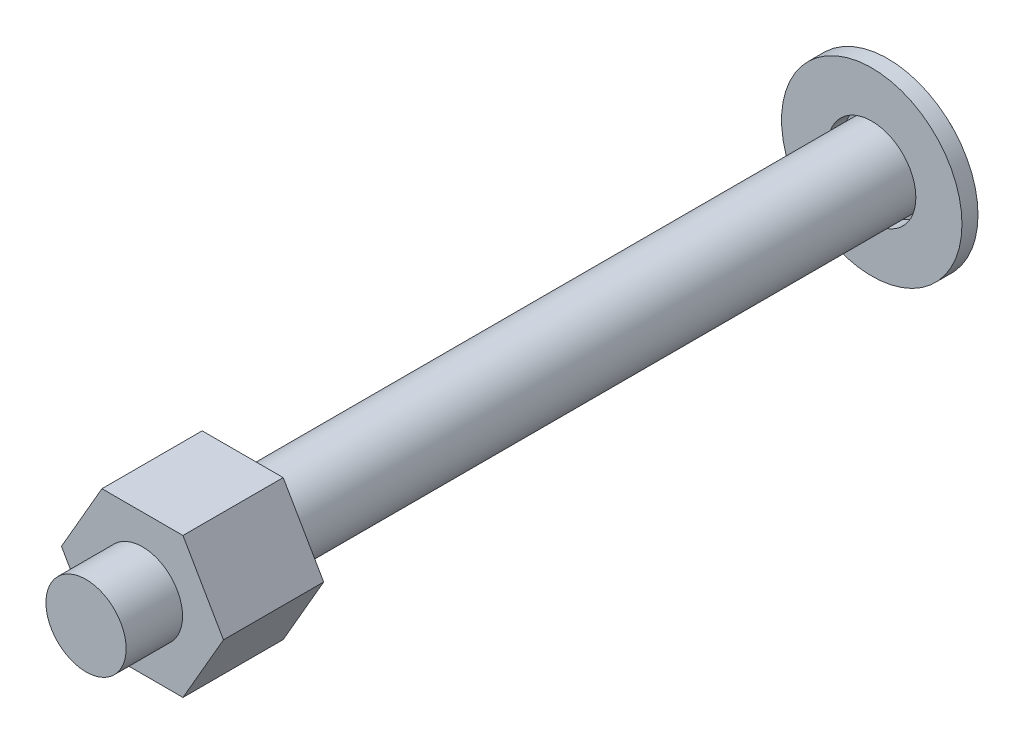
ISO-10303-21;
HEADER;
FILE_DESCRIPTION(('STEP AP214'),'2;1');
FILE_NAME('part.step','',(''),(''),'','','');
FILE_SCHEMA(('AUTOMOTIVE_DESIGN { 1 0 10303 214 1 1 1 1 }'));
ENDSEC;
DATA;
#1=APPLICATION_CONTEXT('core data for automotive mechanical design processes');
#2=APPLICATION_PROTOCOL_DEFINITION('international standard','automotive_design',2000,#1);
#3=PRODUCT_CONTEXT('',#1,'mechanical');
#4=PRODUCT('Part','Part','',(#3));
#5=PRODUCT_RELATED_PRODUCT_CATEGORY('part','',(#4));
#6=PRODUCT_DEFINITION_FORMATION('','',#4);
#7=PRODUCT_DEFINITION_CONTEXT('part definition',#1,'design');
#8=PRODUCT_DEFINITION('design','',#6,#7);
#9=PRODUCT_DEFINITION_SHAPE('','',#8);
#10=(LENGTH_UNIT() NAMED_UNIT(*) SI_UNIT(.MILLI.,.METRE.));
#11=(NAMED_UNIT(*) PLANE_ANGLE_UNIT() SI_UNIT($,.RADIAN.));
#12=(NAMED_UNIT(*) SI_UNIT($,.STERADIAN.) SOLID_ANGLE_UNIT());
#13=UNCERTAINTY_MEASURE_WITH_UNIT(LENGTH_MEASURE(1.E-05),#10,'distance_accuracy_value','');
#14=(GEOMETRIC_REPRESENTATION_CONTEXT(3) GLOBAL_UNCERTAINTY_ASSIGNED_CONTEXT((#13)) GLOBAL_UNIT_ASSIGNED_CONTEXT((#10,
#11,#12)) REPRESENTATION_CONTEXT('',''));
#15=CARTESIAN_POINT('',(0.,0.,0.));
#16=DIRECTION('',(0.,0.,1.));
#17=DIRECTION('',(1.,0.,0.));
#18=AXIS2_PLACEMENT_3D('',#15,#16,#17);
#19=CARTESIAN_POINT('',(61.1,59.9,66.2));
#20=DIRECTION('',(0.,0.,1.));
#21=DIRECTION('',(1.,0.,0.));
#22=AXIS2_PLACEMENT_3D('',#19,#20,#21);
#23=PLANE('',#22);
#24=CARTESIAN_POINT('',(61.1,59.9,66.2));
#25=DIRECTION('',(0.,0.,1.));
#26=DIRECTION('',(1.,0.,0.));
#27=AXIS2_PLACEMENT_3D('',#24,#25,#26);
#28=CIRCLE('',#27,2.);
#29=CARTESIAN_POINT('',(63.1,59.9,66.2));
#30=VERTEX_POINT('',#29);
#31=EDGE_CURVE('E9',#30,#30,#28,.T.);
#32=ORIENTED_EDGE('',*,*,#31,.T.);
#33=EDGE_LOOP('',(#32));
#34=FACE_BOUND('',#33,.T.);
#35=ADVANCED_FACE('F14',(#34),#23,.T.);
#36=CARTESIAN_POINT('',(61.1,59.9,26.2));
#37=DIRECTION('',(0.,0.,1.));
#38=DIRECTION('',(1.,0.,0.));
#39=AXIS2_PLACEMENT_3D('',#36,#37,#38);
#40=CYLINDRICAL_SURFACE('',#39,2.);
#41=DIRECTION('',(0.,0.,1.));
#42=VECTOR('',#41,1.);
#43=CARTESIAN_POINT('',(63.1,59.9,26.2));
#44=LINE('',#43,#42);
#45=CARTESIAN_POINT('',(63.1,59.9,63.384118852459));
#46=VERTEX_POINT('',#45);
#47=EDGE_CURVE('E25',#46,#30,#44,.T.);
#48=ORIENTED_EDGE('',*,*,#47,.T.);
#49=ORIENTED_EDGE('',*,*,#31,.F.);
#50=ORIENTED_EDGE('',*,*,#47,.F.);
#51=CARTESIAN_POINT('',(61.1,59.9,63.384118852459));
#52=DIRECTION('',(0.,0.,1.));
#53=DIRECTION('',(1.,0.,0.));
#54=AXIS2_PLACEMENT_3D('',#51,#52,#53);
#55=CIRCLE('',#54,2.);
#56=EDGE_CURVE('E150',#46,#46,#55,.T.);
#57=ORIENTED_EDGE('',*,*,#56,.T.);
#58=EDGE_LOOP('',(#48,#49,#50,#57));
#59=FACE_BOUND('',#58,.T.);
#60=ADVANCED_FACE('F427',(#59),#40,.T.);
#61=CARTESIAN_POINT('',(61.1,59.9,63.384118852459));
#62=DIRECTION('',(0.,0.,1.));
#63=DIRECTION('',(1.,0.,0.));
#64=AXIS2_PLACEMENT_3D('',#61,#62,#63);
#65=PLANE('',#64);
#66=ORIENTED_EDGE('',*,*,#56,.F.);
#67=EDGE_LOOP('',(#66));
#68=FACE_BOUND('',#67,.T.);
#69=DIRECTION('',(-0.50000000000019,0.866025403784329,0.));
#70=VECTOR('',#69,1.);
#71=CARTESIAN_POINT('',(65.141451884327,59.9,63.384118852459));
#72=LINE('',#71,#70);
#73=CARTESIAN_POINT('',(65.141451884327,59.9,63.384118852459));
#74=VERTEX_POINT('',#73);
#75=CARTESIAN_POINT('',(63.120725942164,63.4,63.384118852459));
#76=VERTEX_POINT('',#75);
#77=EDGE_CURVE('E265',#74,#76,#72,.T.);
#78=ORIENTED_EDGE('',*,*,#77,.T.);
#79=DIRECTION('',(-1.,0.,0.));
#80=VECTOR('',#79,1.);
#81=CARTESIAN_POINT('',(63.120725942164,63.4,63.384118852459));
#82=LINE('',#81,#80);
#83=CARTESIAN_POINT('',(59.079274057836,63.4,63.384118852459));
#84=VERTEX_POINT('',#83);
#85=EDGE_CURVE('E158',#76,#84,#82,.T.);
#86=ORIENTED_EDGE('',*,*,#85,.T.);
#87=DIRECTION('',(-0.50000000000019,-0.866025403784329,0.));
#88=VECTOR('',#87,1.);
#89=CARTESIAN_POINT('',(59.079274057836,63.4,63.384118852459));
#90=LINE('',#89,#88);
#91=CARTESIAN_POINT('',(57.058548115673,59.9,63.384118852459));
#92=VERTEX_POINT('',#91);
#93=EDGE_CURVE('E151',#84,#92,#90,.T.);
#94=ORIENTED_EDGE('',*,*,#93,.T.);
#95=DIRECTION('',(0.50000000000019,-0.866025403784329,0.));
#96=VECTOR('',#95,1.);
#97=CARTESIAN_POINT('',(57.058548115673,59.9,63.384118852459));
#98=LINE('',#97,#96);
#99=CARTESIAN_POINT('',(59.079274057836,56.4,63.384118852459));
#100=VERTEX_POINT('',#99);
#101=EDGE_CURVE('E138',#92,#100,#98,.T.);
#102=ORIENTED_EDGE('',*,*,#101,.T.);
#103=DIRECTION('',(1.,0.,0.));
#104=VECTOR('',#103,1.);
#105=CARTESIAN_POINT('',(59.079274057836,56.4,63.384118852459));
#106=LINE('',#105,#104);
#107=CARTESIAN_POINT('',(63.120725942164,56.4,63.384118852459));
#108=VERTEX_POINT('',#107);
#109=EDGE_CURVE('E174',#100,#108,#106,.T.);
#110=ORIENTED_EDGE('',*,*,#109,.T.);
#111=DIRECTION('',(0.50000000000019,0.866025403784329,0.));
#112=VECTOR('',#111,1.);
#113=CARTESIAN_POINT('',(63.120725942164,56.4,63.384118852459));
#114=LINE('',#113,#112);
#115=EDGE_CURVE('E244',#108,#74,#114,.T.);
#116=ORIENTED_EDGE('',*,*,#115,.T.);
#117=EDGE_LOOP('',(#78,#86,#94,#102,#110,#116));
#118=FACE_BOUND('',#117,.T.);
#119=ADVANCED_FACE('F156',(#68,#118),#65,.T.);
#120=CARTESIAN_POINT('',(57.058548115673,59.9,58.384118852459));
#121=DIRECTION('',(0.866025403784329,0.50000000000019,0.));
#122=DIRECTION('',(0.,0.,-1.));
#123=AXIS2_PLACEMENT_3D('',#120,#121,#122);
#124=PLANE('',#123);
#125=DIRECTION('',(0.50000000000019,-0.866025403784329,0.));
#126=VECTOR('',#125,1.);
#127=CARTESIAN_POINT('',(57.058548115673,59.9,58.384118852459));
#128=LINE('',#127,#126);
#129=CARTESIAN_POINT('',(57.058548115673,59.9,58.384118852459));
#130=VERTEX_POINT('',#129);
#131=CARTESIAN_POINT('',(59.079274057836,56.4,58.384118852459));
#132=VERTEX_POINT('',#131);
#133=EDGE_CURVE('E182',#130,#132,#128,.T.);
#134=ORIENTED_EDGE('',*,*,#133,.T.);
#135=DIRECTION('',(0.,0.,1.));
#136=VECTOR('',#135,1.);
#137=CARTESIAN_POINT('',(59.079274057836,56.4,58.384118852459));
#138=LINE('',#137,#136);
#139=EDGE_CURVE('E145',#132,#100,#138,.T.);
#140=ORIENTED_EDGE('',*,*,#139,.T.);
#141=ORIENTED_EDGE('',*,*,#101,.F.);
#142=DIRECTION('',(0.,0.,1.));
#143=VECTOR('',#142,1.);
#144=CARTESIAN_POINT('',(57.058548115673,59.9,58.384118852459));
#145=LINE('',#144,#143);
#146=EDGE_CURVE('E143',#130,#92,#145,.T.);
#147=ORIENTED_EDGE('',*,*,#146,.F.);
#148=EDGE_LOOP('',(#134,#140,#141,#147));
#149=FACE_BOUND('',#148,.T.);
#150=ADVANCED_FACE('F141',(#149),#124,.F.);
#151=CARTESIAN_POINT('',(59.079274057836,63.4,58.384118852459));
#152=DIRECTION('',(0.866025403784329,-0.50000000000019,0.));
#153=DIRECTION('',(0.,0.,-1.));
#154=AXIS2_PLACEMENT_3D('',#151,#152,#153);
#155=PLANE('',#154);
#156=DIRECTION('',(-0.50000000000019,-0.866025403784329,0.));
#157=VECTOR('',#156,1.);
#158=CARTESIAN_POINT('',(59.079274057836,63.4,58.384118852459));
#159=LINE('',#158,#157);
#160=CARTESIAN_POINT('',(59.079274057836,63.4,58.384118852459));
#161=VERTEX_POINT('',#160);
#162=EDGE_CURVE('E166',#161,#130,#159,.T.);
#163=ORIENTED_EDGE('',*,*,#162,.T.);
#164=ORIENTED_EDGE('',*,*,#146,.T.);
#165=ORIENTED_EDGE('',*,*,#93,.F.);
#166=DIRECTION('',(0.,0.,1.));
#167=VECTOR('',#166,1.);
#168=CARTESIAN_POINT('',(59.079274057836,63.4,58.384118852459));
#169=LINE('',#168,#167);
#170=EDGE_CURVE('E202',#161,#84,#169,.T.);
#171=ORIENTED_EDGE('',*,*,#170,.F.);
#172=EDGE_LOOP('',(#163,#164,#165,#171));
#173=FACE_BOUND('',#172,.T.);
#174=ADVANCED_FACE('F164',(#173),#155,.F.);
#175=CARTESIAN_POINT('',(59.079274057836,56.4,58.384118852459));
#176=DIRECTION('',(0.,1.,0.));
#177=DIRECTION('',(1.,0.,0.));
#178=AXIS2_PLACEMENT_3D('',#175,#176,#177);
#179=PLANE('',#178);
#180=DIRECTION('',(1.,0.,0.));
#181=VECTOR('',#180,1.);
#182=CARTESIAN_POINT('',(59.079274057836,56.4,58.384118852459));
#183=LINE('',#182,#181);
#184=CARTESIAN_POINT('',(63.120725942164,56.4,58.384118852459));
#185=VERTEX_POINT('',#184);
#186=EDGE_CURVE('E229',#132,#185,#183,.T.);
#187=ORIENTED_EDGE('',*,*,#186,.T.);
#188=DIRECTION('',(0.,0.,1.));
#189=VECTOR('',#188,1.);
#190=CARTESIAN_POINT('',(63.120725942164,56.4,58.384118852459));
#191=LINE('',#190,#189);
#192=EDGE_CURVE('E111',#185,#108,#191,.T.);
#193=ORIENTED_EDGE('',*,*,#192,.T.);
#194=ORIENTED_EDGE('',*,*,#109,.F.);
#195=ORIENTED_EDGE('',*,*,#139,.F.);
#196=EDGE_LOOP('',(#187,#193,#194,#195));
#197=FACE_BOUND('',#196,.T.);
#198=ADVANCED_FACE('F321',(#197),#179,.F.);
#199=CARTESIAN_POINT('',(63.120725942164,63.4,58.384118852459));
#200=DIRECTION('',(0.,-1.,0.));
#201=DIRECTION('',(-1.,0.,0.));
#202=AXIS2_PLACEMENT_3D('',#199,#200,#201);
#203=PLANE('',#202);
#204=DIRECTION('',(-1.,0.,0.));
#205=VECTOR('',#204,1.);
#206=CARTESIAN_POINT('',(63.120725942164,63.4,58.384118852459));
#207=LINE('',#206,#205);
#208=CARTESIAN_POINT('',(63.120725942164,63.4,58.384118852459));
#209=VERTEX_POINT('',#208);
#210=EDGE_CURVE('E181',#209,#161,#207,.T.);
#211=ORIENTED_EDGE('',*,*,#210,.T.);
#212=ORIENTED_EDGE('',*,*,#170,.T.);
#213=ORIENTED_EDGE('',*,*,#85,.F.);
#214=DIRECTION('',(0.,0.,1.));
#215=VECTOR('',#214,1.);
#216=CARTESIAN_POINT('',(63.120725942164,63.4,58.384118852459));
#217=LINE('',#216,#215);
#218=EDGE_CURVE('E261',#209,#76,#217,.T.);
#219=ORIENTED_EDGE('',*,*,#218,.F.);
#220=EDGE_LOOP('',(#211,#212,#213,#219));
#221=FACE_BOUND('',#220,.T.);
#222=ADVANCED_FACE('F333',(#221),#203,.F.);
#223=CARTESIAN_POINT('',(63.120725942164,56.4,58.384118852459));
#224=DIRECTION('',(-0.866025403784329,0.50000000000019,0.));
#225=DIRECTION('',(0.,0.,1.));
#226=AXIS2_PLACEMENT_3D('',#223,#224,#225);
#227=PLANE('',#226);
#228=DIRECTION('',(0.50000000000019,0.866025403784329,0.));
#229=VECTOR('',#228,1.);
#230=CARTESIAN_POINT('',(63.120725942164,56.4,58.384118852459));
#231=LINE('',#230,#229);
#232=CARTESIAN_POINT('',(65.141451884327,59.9,58.384118852459));
#233=VERTEX_POINT('',#232);
#234=EDGE_CURVE('E260',#185,#233,#231,.T.);
#235=ORIENTED_EDGE('',*,*,#234,.T.);
#236=DIRECTION('',(0.,0.,1.));
#237=VECTOR('',#236,1.);
#238=CARTESIAN_POINT('',(65.141451884327,59.9,58.384118852459));
#239=LINE('',#238,#237);
#240=EDGE_CURVE('E95',#233,#74,#239,.T.);
#241=ORIENTED_EDGE('',*,*,#240,.T.);
#242=ORIENTED_EDGE('',*,*,#115,.F.);
#243=ORIENTED_EDGE('',*,*,#192,.F.);
#244=EDGE_LOOP('',(#235,#241,#242,#243));
#245=FACE_BOUND('',#244,.T.);
#246=ADVANCED_FACE('F16',(#245),#227,.F.);
#247=CARTESIAN_POINT('',(65.141451884327,59.9,58.384118852459));
#248=DIRECTION('',(-0.866025403784329,-0.50000000000019,0.));
#249=DIRECTION('',(-0.50000000000019,0.866025403784329,0.));
#250=AXIS2_PLACEMENT_3D('',#247,#248,#249);
#251=PLANE('',#250);
#252=DIRECTION('',(-0.50000000000019,0.866025403784329,0.));
#253=VECTOR('',#252,1.);
#254=CARTESIAN_POINT('',(65.141451884327,59.9,58.384118852459));
#255=LINE('',#254,#253);
#256=EDGE_CURVE('E266',#233,#209,#255,.T.);
#257=ORIENTED_EDGE('',*,*,#256,.T.);
#258=ORIENTED_EDGE('',*,*,#218,.T.);
#259=ORIENTED_EDGE('',*,*,#77,.F.);
#260=ORIENTED_EDGE('',*,*,#240,.F.);
#261=EDGE_LOOP('',(#257,#258,#259,#260));
#262=FACE_BOUND('',#261,.T.);
#263=ADVANCED_FACE('F330',(#262),#251,.F.);
#264=CARTESIAN_POINT('',(61.1,59.9,58.384118852459));
#265=DIRECTION('',(0.,0.,1.));
#266=DIRECTION('',(1.,0.,0.));
#267=AXIS2_PLACEMENT_3D('',#264,#265,#266);
#268=PLANE('',#267);
#269=CARTESIAN_POINT('',(61.1,59.9,58.384118852459));
#270=DIRECTION('',(0.,0.,1.));
#271=DIRECTION('',(1.,0.,0.));
#272=AXIS2_PLACEMENT_3D('',#269,#270,#271);
#273=CIRCLE('',#272,2.);
#274=CARTESIAN_POINT('',(63.1,59.9,58.384118852459));
#275=VERTEX_POINT('',#274);
#276=EDGE_CURVE('E253',#275,#275,#273,.T.);
#277=ORIENTED_EDGE('',*,*,#276,.T.);
#278=EDGE_LOOP('',(#277));
#279=FACE_BOUND('',#278,.T.);
#280=ORIENTED_EDGE('',*,*,#234,.F.);
#281=ORIENTED_EDGE('',*,*,#186,.F.);
#282=ORIENTED_EDGE('',*,*,#133,.F.);
#283=ORIENTED_EDGE('',*,*,#162,.F.);
#284=ORIENTED_EDGE('',*,*,#210,.F.);
#285=ORIENTED_EDGE('',*,*,#256,.F.);
#286=EDGE_LOOP('',(#280,#281,#282,#283,#284,#285));
#287=FACE_BOUND('',#286,.T.);
#288=ADVANCED_FACE('F421',(#279,#287),#268,.F.);
#289=CARTESIAN_POINT('',(61.1,59.9,26.2));
#290=DIRECTION('',(0.,0.,1.));
#291=DIRECTION('',(1.,0.,0.));
#292=AXIS2_PLACEMENT_3D('',#289,#290,#291);
#293=CYLINDRICAL_SURFACE('',#292,2.);
#294=ORIENTED_EDGE('',*,*,#276,.F.);
#295=DIRECTION('',(0.,0.,1.));
#296=VECTOR('',#295,1.);
#297=CARTESIAN_POINT('',(63.1,59.9,26.2));
#298=LINE('',#297,#296);
#299=CARTESIAN_POINT('',(63.1,59.9,26.2));
#300=VERTEX_POINT('',#299);
#301=EDGE_CURVE('E267',#300,#275,#298,.T.);
#302=ORIENTED_EDGE('',*,*,#301,.F.);
#303=CARTESIAN_POINT('',(61.1,59.9,26.2));
#304=DIRECTION('',(0.,0.,1.));
#305=DIRECTION('',(1.,0.,0.));
#306=AXIS2_PLACEMENT_3D('',#303,#304,#305);
#307=CIRCLE('',#306,2.);
#308=EDGE_CURVE('E226',#300,#300,#307,.T.);
#309=ORIENTED_EDGE('',*,*,#308,.T.);
#310=ORIENTED_EDGE('',*,*,#301,.T.);
#311=EDGE_LOOP('',(#294,#302,#309,#310));
#312=FACE_BOUND('',#311,.T.);
#313=ADVANCED_FACE('F411',(#312),#293,.T.);
#314=CARTESIAN_POINT('',(61.1,59.9,26.2));
#315=DIRECTION('',(0.,0.,1.));
#316=DIRECTION('',(1.,0.,0.));
#317=AXIS2_PLACEMENT_3D('',#314,#315,#316);
#318=PLANE('',#317);
#319=ORIENTED_EDGE('',*,*,#308,.F.);
#320=EDGE_LOOP('',(#319));
#321=FACE_BOUND('',#320,.T.);
#322=CARTESIAN_POINT('',(61.1,59.9,26.2));
#323=DIRECTION('',(0.,0.,1.));
#324=DIRECTION('',(1.,0.,0.));
#325=AXIS2_PLACEMENT_3D('',#322,#323,#324);
#326=CIRCLE('',#325,2.2);
#327=CARTESIAN_POINT('',(63.3,59.9,26.2));
#328=VERTEX_POINT('',#327);
#329=EDGE_CURVE('E223',#328,#328,#326,.T.);
#330=ORIENTED_EDGE('',*,*,#329,.T.);
#331=EDGE_LOOP('',(#330));
#332=FACE_BOUND('',#331,.T.);
#333=ADVANCED_FACE('F409',(#321,#332),#318,.T.);
#334=CARTESIAN_POINT('',(61.1,59.9,25.7));
#335=DIRECTION('',(0.,0.,1.));
#336=DIRECTION('',(1.,0.,0.));
#337=AXIS2_PLACEMENT_3D('',#334,#335,#336);
#338=CYLINDRICAL_SURFACE('',#337,2.2);
#339=DIRECTION('',(0.,0.,1.));
#340=VECTOR('',#339,1.);
#341=CARTESIAN_POINT('',(63.3,59.9,25.7));
#342=LINE('',#341,#340);
#343=CARTESIAN_POINT('',(63.3,59.9,27.));
#344=VERTEX_POINT('',#343);
#345=EDGE_CURVE('E178',#328,#344,#342,.T.);
#346=ORIENTED_EDGE('',*,*,#345,.F.);
#347=ORIENTED_EDGE('',*,*,#329,.F.);
#348=ORIENTED_EDGE('',*,*,#345,.T.);
#349=CARTESIAN_POINT('',(61.1,59.9,27.));
#350=DIRECTION('',(0.,0.,1.));
#351=DIRECTION('',(1.,0.,0.));
#352=AXIS2_PLACEMENT_3D('',#349,#350,#351);
#353=CIRCLE('',#352,2.2);
#354=EDGE_CURVE('E218',#344,#344,#353,.T.);
#355=ORIENTED_EDGE('',*,*,#354,.T.);
#356=EDGE_LOOP('',(#346,#347,#348,#355));
#357=FACE_BOUND('',#356,.T.);
#358=ADVANCED_FACE('F406',(#357),#338,.F.);
#359=CARTESIAN_POINT('',(61.1,59.9,27.));
#360=DIRECTION('',(0.,0.,1.));
#361=DIRECTION('',(1.,0.,0.));
#362=AXIS2_PLACEMENT_3D('',#359,#360,#361);
#363=PLANE('',#362);
#364=ORIENTED_EDGE('',*,*,#354,.F.);
#365=EDGE_LOOP('',(#364));
#366=FACE_BOUND('',#365,.T.);
#367=CARTESIAN_POINT('',(61.1,59.9,27.));
#368=DIRECTION('',(0.,0.,1.));
#369=DIRECTION('',(1.,0.,0.));
#370=AXIS2_PLACEMENT_3D('',#367,#368,#369);
#371=CIRCLE('',#370,4.5);
#372=CARTESIAN_POINT('',(65.6,59.9,27.));
#373=VERTEX_POINT('',#372);
#374=EDGE_CURVE('E216',#373,#373,#371,.T.);
#375=ORIENTED_EDGE('',*,*,#374,.T.);
#376=EDGE_LOOP('',(#375));
#377=FACE_BOUND('',#376,.T.);
#378=ADVANCED_FACE('F419',(#366,#377),#363,.T.);
#379=CARTESIAN_POINT('',(61.1,59.9,26.2));
#380=DIRECTION('',(0.,0.,1.));
#381=DIRECTION('',(1.,0.,0.));
#382=AXIS2_PLACEMENT_3D('',#379,#380,#381);
#383=CYLINDRICAL_SURFACE('',#382,4.5);
#384=ORIENTED_EDGE('',*,*,#374,.F.);
#385=DIRECTION('',(0.,0.,1.));
#386=VECTOR('',#385,1.);
#387=CARTESIAN_POINT('',(65.6,59.9,26.2));
#388=LINE('',#387,#386);
#389=CARTESIAN_POINT('',(65.6,59.9,26.2));
#390=VERTEX_POINT('',#389);
#391=EDGE_CURVE('E222',#390,#373,#388,.T.);
#392=ORIENTED_EDGE('',*,*,#391,.F.);
#393=CARTESIAN_POINT('',(61.1,59.9,26.2));
#394=DIRECTION('',(0.,0.,1.));
#395=DIRECTION('',(1.,0.,0.));
#396=AXIS2_PLACEMENT_3D('',#393,#394,#395);
#397=CIRCLE('',#396,4.5);
#398=EDGE_CURVE('E212',#390,#390,#397,.T.);
#399=ORIENTED_EDGE('',*,*,#398,.T.);
#400=ORIENTED_EDGE('',*,*,#391,.T.);
#401=EDGE_LOOP('',(#384,#392,#399,#400));
#402=FACE_BOUND('',#401,.T.);
#403=ADVANCED_FACE('F446',(#402),#383,.T.);
#404=CARTESIAN_POINT('',(61.1,59.9,25.3));
#405=DIRECTION('',(0.,0.,1.));
#406=DIRECTION('',(1.,0.,0.));
#407=AXIS2_PLACEMENT_3D('',#404,#405,#406);
#408=PLANE('',#407);
#409=DIRECTION('',(0.50000000000019,0.866025403784329,0.));
#410=VECTOR('',#409,1.);
#411=CARTESIAN_POINT('',(61.821687836487,58.65,25.3));
#412=LINE('',#411,#410);
#413=CARTESIAN_POINT('',(61.821687836487,58.65,25.3));
#414=VERTEX_POINT('',#413);
#415=CARTESIAN_POINT('',(62.543375672974,59.9,25.3));
#416=VERTEX_POINT('',#415);
#417=EDGE_CURVE('E276',#414,#416,#412,.T.);
#418=ORIENTED_EDGE('',*,*,#417,.F.);
#419=DIRECTION('',(1.,0.,0.));
#420=VECTOR('',#419,1.);
#421=CARTESIAN_POINT('',(60.378312163513,58.65,25.3));
#422=LINE('',#421,#420);
#423=CARTESIAN_POINT('',(60.378312163513,58.65,25.3));
#424=VERTEX_POINT('',#423);
#425=EDGE_CURVE('E237',#424,#414,#422,.T.);
#426=ORIENTED_EDGE('',*,*,#425,.F.);
#427=DIRECTION('',(0.50000000000019,-0.866025403784329,0.));
#428=VECTOR('',#427,1.);
#429=CARTESIAN_POINT('',(59.656624327026,59.9,25.3));
#430=LINE('',#429,#428);
#431=CARTESIAN_POINT('',(59.656624327026,59.9,25.3));
#432=VERTEX_POINT('',#431);
#433=EDGE_CURVE('E308',#432,#424,#430,.T.);
#434=ORIENTED_EDGE('',*,*,#433,.F.);
#435=DIRECTION('',(-0.50000000000019,-0.866025403784329,0.));
#436=VECTOR('',#435,1.);
#437=CARTESIAN_POINT('',(60.378312163513,61.15,25.3));
#438=LINE('',#437,#436);
#439=CARTESIAN_POINT('',(60.378312163513,61.15,25.3));
#440=VERTEX_POINT('',#439);
#441=EDGE_CURVE('E257',#440,#432,#438,.T.);
#442=ORIENTED_EDGE('',*,*,#441,.F.);
#443=DIRECTION('',(-1.,0.,0.));
#444=VECTOR('',#443,1.);
#445=CARTESIAN_POINT('',(61.821687836487,61.15,25.3));
#446=LINE('',#445,#444);
#447=CARTESIAN_POINT('',(61.821687836487,61.15,25.3));
#448=VERTEX_POINT('',#447);
#449=EDGE_CURVE('E239',#448,#440,#446,.T.);
#450=ORIENTED_EDGE('',*,*,#449,.F.);
#451=DIRECTION('',(-0.50000000000019,0.866025403784329,0.));
#452=VECTOR('',#451,1.);
#453=CARTESIAN_POINT('',(62.543375672974,59.9,25.3));
#454=LINE('',#453,#452);
#455=EDGE_CURVE('E217',#416,#448,#454,.T.);
#456=ORIENTED_EDGE('',*,*,#455,.F.);
#457=EDGE_LOOP('',(#418,#426,#434,#442,#450,#456));
#458=FACE_BOUND('',#457,.T.);
#459=ADVANCED_FACE('F396',(#458),#408,.F.);
#460=CARTESIAN_POINT('',(61.1,59.9,26.2));
#461=DIRECTION('',(0.,0.,1.));
#462=DIRECTION('',(1.,0.,0.));
#463=AXIS2_PLACEMENT_3D('',#460,#461,#462);
#464=PLANE('',#463);
#465=CARTESIAN_POINT('',(61.1,59.9,26.2));
#466=DIRECTION('',(0.,0.,1.));
#467=DIRECTION('',(1.,0.,0.));
#468=AXIS2_PLACEMENT_3D('',#465,#466,#467);
#469=CIRCLE('',#468,3.8);
#470=CARTESIAN_POINT('',(64.9,59.9,26.2));
#471=VERTEX_POINT('',#470);
#472=EDGE_CURVE('E193',#471,#471,#469,.T.);
#473=ORIENTED_EDGE('',*,*,#472,.T.);
#474=EDGE_LOOP('',(#473));
#475=FACE_BOUND('',#474,.T.);
#476=ORIENTED_EDGE('',*,*,#398,.F.);
#477=EDGE_LOOP('',(#476));
#478=FACE_BOUND('',#477,.T.);
#479=ADVANCED_FACE('F443',(#475,#478),#464,.F.);
#480=CARTESIAN_POINT('',(62.543375672974,59.9,23.9));
#481=DIRECTION('',(-0.866025403784329,-0.50000000000019,0.));
#482=DIRECTION('',(-0.50000000000019,0.866025403784329,0.));
#483=AXIS2_PLACEMENT_3D('',#480,#481,#482);
#484=PLANE('',#483);
#485=CARTESIAN_POINT('',(62.182531754731,60.525,28.381818181818));
#486=DIRECTION('',(-0.866025403784329,-0.50000000000019,0.));
#487=DIRECTION('',(0.50000000000019,-0.866025403784329,0.));
#488=AXIS2_PLACEMENT_3D('',#485,#486,#487);
#489=CIRCLE('',#488,4.199741727596);
#490=CARTESIAN_POINT('',(61.821687836487,61.15,24.244548883697));
#491=VERTEX_POINT('',#490);
#492=CARTESIAN_POINT('',(62.543375672974,59.9,24.244548883697));
#493=VERTEX_POINT('',#492);
#494=EDGE_CURVE('E197',#491,#493,#489,.T.);
#495=ORIENTED_EDGE('',*,*,#494,.T.);
#496=DIRECTION('',(0.,0.,1.));
#497=VECTOR('',#496,1.);
#498=CARTESIAN_POINT('',(62.543375672974,59.9,23.9));
#499=LINE('',#498,#497);
#500=EDGE_CURVE('E238',#493,#416,#499,.T.);
#501=ORIENTED_EDGE('',*,*,#500,.T.);
#502=ORIENTED_EDGE('',*,*,#455,.T.);
#503=DIRECTION('',(0.,0.,1.));
#504=VECTOR('',#503,1.);
#505=CARTESIAN_POINT('',(61.821687836487,61.15,23.9));
#506=LINE('',#505,#504);
#507=EDGE_CURVE('E243',#491,#448,#506,.T.);
#508=ORIENTED_EDGE('',*,*,#507,.F.);
#509=EDGE_LOOP('',(#495,#501,#502,#508));
#510=FACE_BOUND('',#509,.T.);
#511=ADVANCED_FACE('F379',(#510),#484,.T.);
#512=CARTESIAN_POINT('',(61.821687836487,61.15,23.9));
#513=DIRECTION('',(0.,-1.,0.));
#514=DIRECTION('',(-1.,0.,0.));
#515=AXIS2_PLACEMENT_3D('',#512,#513,#514);
#516=PLANE('',#515);
#517=CARTESIAN_POINT('',(61.1,61.15,28.381818181818));
#518=DIRECTION('',(0.,-1.,0.));
#519=DIRECTION('',(1.,0.,0.));
#520=AXIS2_PLACEMENT_3D('',#517,#518,#519);
#521=CIRCLE('',#520,4.199741727596);
#522=CARTESIAN_POINT('',(60.378312163513,61.15,24.244548883697));
#523=VERTEX_POINT('',#522);
#524=EDGE_CURVE('E208',#523,#491,#521,.T.);
#525=ORIENTED_EDGE('',*,*,#524,.T.);
#526=ORIENTED_EDGE('',*,*,#507,.T.);
#527=ORIENTED_EDGE('',*,*,#449,.T.);
#528=DIRECTION('',(0.,0.,1.));
#529=VECTOR('',#528,1.);
#530=CARTESIAN_POINT('',(60.378312163513,61.15,23.9));
#531=LINE('',#530,#529);
#532=EDGE_CURVE('E18',#523,#440,#531,.T.);
#533=ORIENTED_EDGE('',*,*,#532,.F.);
#534=EDGE_LOOP('',(#525,#526,#527,#533));
#535=FACE_BOUND('',#534,.T.);
#536=ADVANCED_FACE('F383',(#535),#516,.T.);
#537=CARTESIAN_POINT('',(60.378312163513,61.15,23.9));
#538=DIRECTION('',(0.866025403784329,-0.50000000000019,0.));
#539=DIRECTION('',(0.,0.,-1.));
#540=AXIS2_PLACEMENT_3D('',#537,#538,#539);
#541=PLANE('',#540);
#542=CARTESIAN_POINT('',(60.017468245269,60.525,28.381818181818));
#543=DIRECTION('',(0.866025403784329,-0.50000000000019,0.));
#544=DIRECTION('',(0.50000000000019,0.866025403784329,0.));
#545=AXIS2_PLACEMENT_3D('',#542,#543,#544);
#546=CIRCLE('',#545,4.199741727596);
#547=CARTESIAN_POINT('',(59.656624327026,59.9,24.244548883697));
#548=VERTEX_POINT('',#547);
#549=EDGE_CURVE('E201',#548,#523,#546,.T.);
#550=ORIENTED_EDGE('',*,*,#549,.T.);
#551=ORIENTED_EDGE('',*,*,#532,.T.);
#552=ORIENTED_EDGE('',*,*,#441,.T.);
#553=DIRECTION('',(0.,0.,1.));
#554=VECTOR('',#553,1.);
#555=CARTESIAN_POINT('',(59.656624327026,59.9,23.9));
#556=LINE('',#555,#554);
#557=EDGE_CURVE('E305',#548,#432,#556,.T.);
#558=ORIENTED_EDGE('',*,*,#557,.F.);
#559=EDGE_LOOP('',(#550,#551,#552,#558));
#560=FACE_BOUND('',#559,.T.);
#561=ADVANCED_FACE('F388',(#560),#541,.T.);
#562=CARTESIAN_POINT('',(59.656624327026,59.9,23.9));
#563=DIRECTION('',(0.866025403784329,0.50000000000019,0.));
#564=DIRECTION('',(0.,0.,-1.));
#565=AXIS2_PLACEMENT_3D('',#562,#563,#564);
#566=PLANE('',#565);
#567=CARTESIAN_POINT('',(60.017468245269,59.275,28.381818181818));
#568=DIRECTION('',(0.866025403784329,0.50000000000019,0.));
#569=DIRECTION('',(-0.50000000000019,0.866025403784329,0.));
#570=AXIS2_PLACEMENT_3D('',#567,#568,#569);
#571=CIRCLE('',#570,4.199741727596);
#572=CARTESIAN_POINT('',(60.378312163513,58.65,24.244548883697));
#573=VERTEX_POINT('',#572);
#574=EDGE_CURVE('E187',#573,#548,#571,.T.);
#575=ORIENTED_EDGE('',*,*,#574,.T.);
#576=ORIENTED_EDGE('',*,*,#557,.T.);
#577=ORIENTED_EDGE('',*,*,#433,.T.);
#578=DIRECTION('',(0.,0.,1.));
#579=VECTOR('',#578,1.);
#580=CARTESIAN_POINT('',(60.378312163513,58.65,23.9));
#581=LINE('',#580,#579);
#582=EDGE_CURVE('E233',#573,#424,#581,.T.);
#583=ORIENTED_EDGE('',*,*,#582,.F.);
#584=EDGE_LOOP('',(#575,#576,#577,#583));
#585=FACE_BOUND('',#584,.T.);
#586=ADVANCED_FACE('F391',(#585),#566,.T.);
#587=CARTESIAN_POINT('',(60.378312163513,58.65,23.9));
#588=DIRECTION('',(0.,1.,0.));
#589=DIRECTION('',(1.,0.,0.));
#590=AXIS2_PLACEMENT_3D('',#587,#588,#589);
#591=PLANE('',#590);
#592=CARTESIAN_POINT('',(61.1,58.65,28.381818181818));
#593=DIRECTION('',(0.,1.,0.));
#594=DIRECTION('',(-1.,0.,0.));
#595=AXIS2_PLACEMENT_3D('',#592,#593,#594);
#596=CIRCLE('',#595,4.199741727596);
#597=CARTESIAN_POINT('',(61.821687836487,58.65,24.244548883697));
#598=VERTEX_POINT('',#597);
#599=EDGE_CURVE('E183',#598,#573,#596,.T.);
#600=ORIENTED_EDGE('',*,*,#599,.T.);
#601=ORIENTED_EDGE('',*,*,#582,.T.);
#602=ORIENTED_EDGE('',*,*,#425,.T.);
#603=DIRECTION('',(0.,0.,1.));
#604=VECTOR('',#603,1.);
#605=CARTESIAN_POINT('',(61.821687836487,58.65,23.9));
#606=LINE('',#605,#604);
#607=EDGE_CURVE('E286',#598,#414,#606,.T.);
#608=ORIENTED_EDGE('',*,*,#607,.F.);
#609=EDGE_LOOP('',(#600,#601,#602,#608));
#610=FACE_BOUND('',#609,.T.);
#611=ADVANCED_FACE('F394',(#610),#591,.T.);
#612=CARTESIAN_POINT('',(61.821687836487,58.65,23.9));
#613=DIRECTION('',(-0.866025403784329,0.50000000000019,0.));
#614=DIRECTION('',(0.,0.,1.));
#615=AXIS2_PLACEMENT_3D('',#612,#613,#614);
#616=PLANE('',#615);
#617=CARTESIAN_POINT('',(62.182531754731,59.275,28.381818181818));
#618=DIRECTION('',(-0.866025403784329,0.50000000000019,0.));
#619=DIRECTION('',(-0.50000000000019,-0.866025403784329,0.));
#620=AXIS2_PLACEMENT_3D('',#617,#618,#619);
#621=CIRCLE('',#620,4.199741727596);
#622=EDGE_CURVE('E186',#493,#598,#621,.T.);
#623=ORIENTED_EDGE('',*,*,#622,.T.);
#624=ORIENTED_EDGE('',*,*,#607,.T.);
#625=ORIENTED_EDGE('',*,*,#417,.T.);
#626=ORIENTED_EDGE('',*,*,#500,.F.);
#627=EDGE_LOOP('',(#623,#624,#625,#626));
#628=FACE_BOUND('',#627,.T.);
#629=ADVANCED_FACE('F368',(#628),#616,.T.);
#630=CARTESIAN_POINT('',(61.1,59.9,28.381818181818));
#631=DIRECTION('',(0.,0.,1.));
#632=DIRECTION('',(1.,0.,0.));
#633=AXIS2_PLACEMENT_3D('',#630,#631,#632);
#634=SPHERICAL_SURFACE('',#633,4.381818181818);
#635=CARTESIAN_POINT('',(61.1,59.9,28.381818181818));
#636=DIRECTION('',(0.,-1.,0.));
#637=DIRECTION('',(1.,0.,0.));
#638=AXIS2_PLACEMENT_3D('',#635,#636,#637);
#639=CIRCLE('',#638,4.381818181818);
#640=EDGE_CURVE('E189',#493,#471,#639,.T.);
#641=ORIENTED_EDGE('',*,*,#640,.T.);
#642=ORIENTED_EDGE('',*,*,#472,.F.);
#643=ORIENTED_EDGE('',*,*,#640,.F.);
#644=ORIENTED_EDGE('',*,*,#494,.F.);
#645=ORIENTED_EDGE('',*,*,#524,.F.);
#646=ORIENTED_EDGE('',*,*,#549,.F.);
#647=ORIENTED_EDGE('',*,*,#574,.F.);
#648=ORIENTED_EDGE('',*,*,#599,.F.);
#649=ORIENTED_EDGE('',*,*,#622,.F.);
#650=EDGE_LOOP('',(#641,#642,#643,#644,#645,#646,#647,#648,#649));
#651=FACE_BOUND('',#650,.T.);
#652=ADVANCED_FACE('F373',(#651),#634,.T.);
#653=CLOSED_SHELL('',(#35,#60,#119,#150,#174,#198,#222,#246,#263,#288,#313,#333,#358,#378,#403,
#459,#479,#511,#536,#561,#586,#611,#629,#652));
#654=MANIFOLD_SOLID_BREP('B1',#653);
#655=ADVANCED_BREP_SHAPE_REPRESENTATION('',(#18,#654),#14);
#656=SHAPE_DEFINITION_REPRESENTATION(#9,#655);
ENDSEC;
END-ISO-10303-21;
